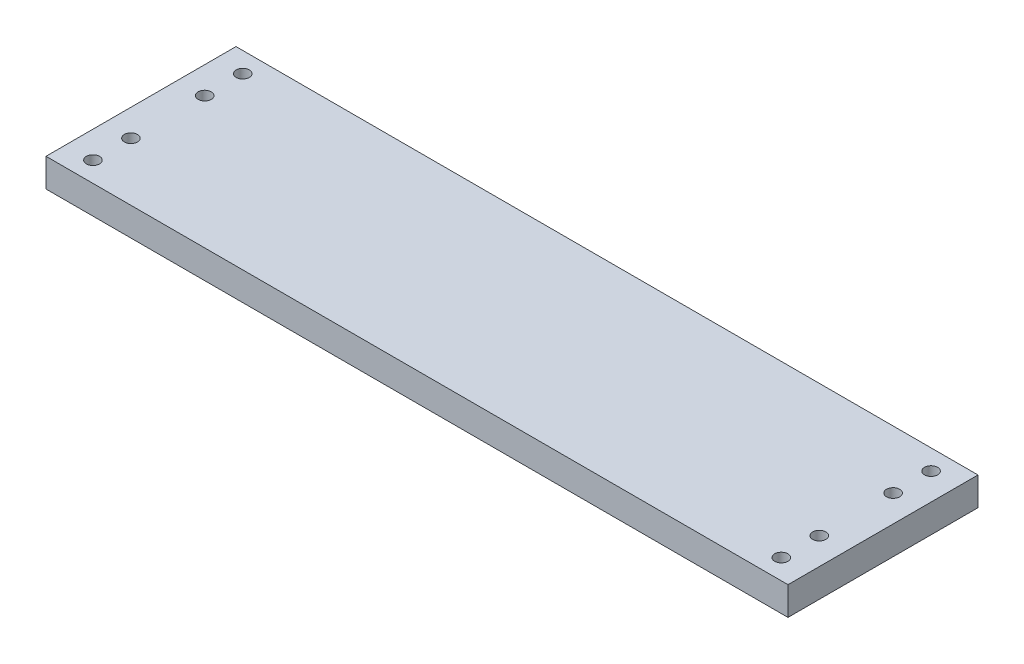
ISO-10303-21;
HEADER;
FILE_DESCRIPTION(('STEP AP214'),'2;1');
FILE_NAME('part.step','',(''),(''),'','','');
FILE_SCHEMA(('AUTOMOTIVE_DESIGN { 1 0 10303 214 1 1 1 1 }'));
ENDSEC;
DATA;
#1=APPLICATION_CONTEXT('core data for automotive mechanical design processes');
#2=APPLICATION_PROTOCOL_DEFINITION('international standard','automotive_design',2000,#1);
#3=PRODUCT_CONTEXT('',#1,'mechanical');
#4=PRODUCT('Part','Part','',(#3));
#5=PRODUCT_RELATED_PRODUCT_CATEGORY('part','',(#4));
#6=PRODUCT_DEFINITION_FORMATION('','',#4);
#7=PRODUCT_DEFINITION_CONTEXT('part definition',#1,'design');
#8=PRODUCT_DEFINITION('design','',#6,#7);
#9=PRODUCT_DEFINITION_SHAPE('','',#8);
#10=(LENGTH_UNIT() NAMED_UNIT(*) SI_UNIT(.MILLI.,.METRE.));
#11=(NAMED_UNIT(*) PLANE_ANGLE_UNIT() SI_UNIT($,.RADIAN.));
#12=(NAMED_UNIT(*) SI_UNIT($,.STERADIAN.) SOLID_ANGLE_UNIT());
#13=UNCERTAINTY_MEASURE_WITH_UNIT(LENGTH_MEASURE(1.E-05),#10,'distance_accuracy_value','');
#14=(GEOMETRIC_REPRESENTATION_CONTEXT(3) GLOBAL_UNCERTAINTY_ASSIGNED_CONTEXT((#13)) GLOBAL_UNIT_ASSIGNED_CONTEXT((#10,
#11,#12)) REPRESENTATION_CONTEXT('',''));
#15=CARTESIAN_POINT('',(0.,0.,0.));
#16=DIRECTION('',(0.,0.,1.));
#17=DIRECTION('',(1.,0.,0.));
#18=AXIS2_PLACEMENT_3D('',#15,#16,#17);
#19=CARTESIAN_POINT('',(-83.,6.35,-21.255));
#20=DIRECTION('',(0.,0.,-1.));
#21=DIRECTION('',(-1.,0.,0.));
#22=AXIS2_PLACEMENT_3D('',#19,#20,#21);
#23=PLANE('',#22);
#24=DIRECTION('',(1.,0.,0.));
#25=VECTOR('',#24,1.);
#26=CARTESIAN_POINT('',(-83.,0.,-21.255));
#27=LINE('',#26,#25);
#28=CARTESIAN_POINT('',(-83.,0.,-21.255));
#29=VERTEX_POINT('',#28);
#30=CARTESIAN_POINT('',(83.,0.,-21.255));
#31=VERTEX_POINT('',#30);
#32=EDGE_CURVE('E111',#29,#31,#27,.T.);
#33=ORIENTED_EDGE('',*,*,#32,.F.);
#34=DIRECTION('',(0.,-1.,0.));
#35=VECTOR('',#34,1.);
#36=CARTESIAN_POINT('',(-83.,6.35,-21.255));
#37=LINE('',#36,#35);
#38=CARTESIAN_POINT('',(-83.,6.35,-21.255));
#39=VERTEX_POINT('',#38);
#40=EDGE_CURVE('E13',#39,#29,#37,.T.);
#41=ORIENTED_EDGE('',*,*,#40,.F.);
#42=DIRECTION('',(1.,0.,0.));
#43=VECTOR('',#42,1.);
#44=CARTESIAN_POINT('',(-83.,6.35,-21.255));
#45=LINE('',#44,#43);
#46=CARTESIAN_POINT('',(83.,6.35,-21.255));
#47=VERTEX_POINT('',#46);
#48=EDGE_CURVE('E105',#39,#47,#45,.T.);
#49=ORIENTED_EDGE('',*,*,#48,.T.);
#50=DIRECTION('',(0.,-1.,0.));
#51=VECTOR('',#50,1.);
#52=CARTESIAN_POINT('',(83.,6.35,-21.255));
#53=LINE('',#52,#51);
#54=EDGE_CURVE('E48',#47,#31,#53,.T.);
#55=ORIENTED_EDGE('',*,*,#54,.T.);
#56=EDGE_LOOP('',(#33,#41,#49,#55));
#57=FACE_BOUND('',#56,.T.);
#58=ADVANCED_FACE('F45',(#57),#23,.T.);
#59=CARTESIAN_POINT('',(-83.,6.35,-21.255));
#60=DIRECTION('',(1.,0.,0.));
#61=DIRECTION('',(0.,0.,-1.));
#62=AXIS2_PLACEMENT_3D('',#59,#60,#61);
#63=PLANE('',#62);
#64=DIRECTION('',(0.,0.,1.));
#65=VECTOR('',#64,1.);
#66=CARTESIAN_POINT('',(-83.,0.,-21.255));
#67=LINE('',#66,#65);
#68=CARTESIAN_POINT('',(-83.,0.,21.255));
#69=VERTEX_POINT('',#68);
#70=EDGE_CURVE('E78',#29,#69,#67,.T.);
#71=ORIENTED_EDGE('',*,*,#70,.T.);
#72=DIRECTION('',(0.,-1.,0.));
#73=VECTOR('',#72,1.);
#74=CARTESIAN_POINT('',(-83.,6.35,21.255));
#75=LINE('',#74,#73);
#76=CARTESIAN_POINT('',(-83.,6.35,21.255));
#77=VERTEX_POINT('',#76);
#78=EDGE_CURVE('E54',#77,#69,#75,.T.);
#79=ORIENTED_EDGE('',*,*,#78,.F.);
#80=DIRECTION('',(0.,0.,1.));
#81=VECTOR('',#80,1.);
#82=CARTESIAN_POINT('',(-83.,6.35,-21.255));
#83=LINE('',#82,#81);
#84=EDGE_CURVE('E95',#39,#77,#83,.T.);
#85=ORIENTED_EDGE('',*,*,#84,.F.);
#86=ORIENTED_EDGE('',*,*,#40,.T.);
#87=EDGE_LOOP('',(#71,#79,#85,#86));
#88=FACE_BOUND('',#87,.T.);
#89=ADVANCED_FACE('F122',(#88),#63,.F.);
#90=CARTESIAN_POINT('',(-83.,6.35,21.255));
#91=DIRECTION('',(0.,0.,-1.));
#92=DIRECTION('',(-1.,0.,0.));
#93=AXIS2_PLACEMENT_3D('',#90,#91,#92);
#94=PLANE('',#93);
#95=DIRECTION('',(1.,0.,0.));
#96=VECTOR('',#95,1.);
#97=CARTESIAN_POINT('',(-83.,0.,21.255));
#98=LINE('',#97,#96);
#99=CARTESIAN_POINT('',(83.,0.,21.255));
#100=VERTEX_POINT('',#99);
#101=EDGE_CURVE('E102',#69,#100,#98,.T.);
#102=ORIENTED_EDGE('',*,*,#101,.T.);
#103=DIRECTION('',(0.,-1.,0.));
#104=VECTOR('',#103,1.);
#105=CARTESIAN_POINT('',(83.,6.35,21.255));
#106=LINE('',#105,#104);
#107=CARTESIAN_POINT('',(83.,6.35,21.255));
#108=VERTEX_POINT('',#107);
#109=EDGE_CURVE('E99',#108,#100,#106,.T.);
#110=ORIENTED_EDGE('',*,*,#109,.F.);
#111=DIRECTION('',(1.,0.,0.));
#112=VECTOR('',#111,1.);
#113=CARTESIAN_POINT('',(-83.,6.35,21.255));
#114=LINE('',#113,#112);
#115=EDGE_CURVE('E90',#77,#108,#114,.T.);
#116=ORIENTED_EDGE('',*,*,#115,.F.);
#117=ORIENTED_EDGE('',*,*,#78,.T.);
#118=EDGE_LOOP('',(#102,#110,#116,#117));
#119=FACE_BOUND('',#118,.T.);
#120=ADVANCED_FACE('F100',(#119),#94,.F.);
#121=CARTESIAN_POINT('',(83.,6.35,-21.255));
#122=DIRECTION('',(1.,0.,0.));
#123=DIRECTION('',(0.,0.,-1.));
#124=AXIS2_PLACEMENT_3D('',#121,#122,#123);
#125=PLANE('',#124);
#126=DIRECTION('',(0.,0.,1.));
#127=VECTOR('',#126,1.);
#128=CARTESIAN_POINT('',(83.,0.,-21.255));
#129=LINE('',#128,#127);
#130=EDGE_CURVE('E114',#31,#100,#129,.T.);
#131=ORIENTED_EDGE('',*,*,#130,.F.);
#132=ORIENTED_EDGE('',*,*,#54,.F.);
#133=DIRECTION('',(0.,0.,1.));
#134=VECTOR('',#133,1.);
#135=CARTESIAN_POINT('',(83.,6.35,-21.255));
#136=LINE('',#135,#134);
#137=EDGE_CURVE('E94',#47,#108,#136,.T.);
#138=ORIENTED_EDGE('',*,*,#137,.T.);
#139=ORIENTED_EDGE('',*,*,#109,.T.);
#140=EDGE_LOOP('',(#131,#132,#138,#139));
#141=FACE_BOUND('',#140,.T.);
#142=ADVANCED_FACE('F104',(#141),#125,.T.);
#143=CARTESIAN_POINT('',(0.,6.35,0.));
#144=DIRECTION('',(0.,-1.,0.));
#145=DIRECTION('',(0.,0.,-1.));
#146=AXIS2_PLACEMENT_3D('',#143,#144,#145);
#147=PLANE('',#146);
#148=CARTESIAN_POINT('',(-77.,6.35,8.25499999999999));
#149=DIRECTION('',(0.,-1.,0.));
#150=DIRECTION('',(0.,0.,-1.));
#151=AXIS2_PLACEMENT_3D('',#148,#149,#150);
#152=CIRCLE('',#151,1.47319999999999);
#153=CARTESIAN_POINT('',(-77.,6.35,6.7818));
#154=VERTEX_POINT('',#153);
#155=EDGE_CURVE('E218',#154,#154,#152,.T.);
#156=ORIENTED_EDGE('',*,*,#155,.T.);
#157=EDGE_LOOP('',(#156));
#158=FACE_BOUND('',#157,.T.);
#159=CARTESIAN_POINT('',(-77.,6.35,16.755));
#160=DIRECTION('',(0.,-1.,0.));
#161=DIRECTION('',(0.,0.,-1.));
#162=AXIS2_PLACEMENT_3D('',#159,#160,#161);
#163=CIRCLE('',#162,1.47319999999999);
#164=CARTESIAN_POINT('',(-77.,6.35,15.2818));
#165=VERTEX_POINT('',#164);
#166=EDGE_CURVE('E228',#165,#165,#163,.T.);
#167=ORIENTED_EDGE('',*,*,#166,.T.);
#168=EDGE_LOOP('',(#167));
#169=FACE_BOUND('',#168,.T.);
#170=CARTESIAN_POINT('',(77.,6.35,8.25500000000001));
#171=DIRECTION('',(0.,-1.,0.));
#172=DIRECTION('',(0.,0.,-1.));
#173=AXIS2_PLACEMENT_3D('',#170,#171,#172);
#174=CIRCLE('',#173,1.47319999999999);
#175=CARTESIAN_POINT('',(77.,6.35,6.78180000000001));
#176=VERTEX_POINT('',#175);
#177=EDGE_CURVE('E237',#176,#176,#174,.T.);
#178=ORIENTED_EDGE('',*,*,#177,.T.);
#179=EDGE_LOOP('',(#178));
#180=FACE_BOUND('',#179,.T.);
#181=CARTESIAN_POINT('',(77.,6.35,16.755));
#182=DIRECTION('',(0.,-1.,0.));
#183=DIRECTION('',(0.,0.,-1.));
#184=AXIS2_PLACEMENT_3D('',#181,#182,#183);
#185=CIRCLE('',#184,1.47319999999999);
#186=CARTESIAN_POINT('',(77.,6.35,15.2818));
#187=VERTEX_POINT('',#186);
#188=EDGE_CURVE('E246',#187,#187,#185,.T.);
#189=ORIENTED_EDGE('',*,*,#188,.T.);
#190=EDGE_LOOP('',(#189));
#191=FACE_BOUND('',#190,.T.);
#192=CARTESIAN_POINT('',(-77.,6.35,-8.25499999999999));
#193=DIRECTION('',(0.,1.,0.));
#194=DIRECTION('',(0.,0.,1.));
#195=AXIS2_PLACEMENT_3D('',#192,#193,#194);
#196=CIRCLE('',#195,1.47319999999999);
#197=CARTESIAN_POINT('',(-77.,6.35,-6.7818));
#198=VERTEX_POINT('',#197);
#199=EDGE_CURVE('E273',#198,#198,#196,.T.);
#200=ORIENTED_EDGE('',*,*,#199,.F.);
#201=EDGE_LOOP('',(#200));
#202=FACE_BOUND('',#201,.T.);
#203=CARTESIAN_POINT('',(-77.,6.35,-16.755));
#204=DIRECTION('',(0.,1.,0.));
#205=DIRECTION('',(0.,0.,1.));
#206=AXIS2_PLACEMENT_3D('',#203,#204,#205);
#207=CIRCLE('',#206,1.47319999999999);
#208=CARTESIAN_POINT('',(-77.,6.35,-15.2818));
#209=VERTEX_POINT('',#208);
#210=EDGE_CURVE('E276',#209,#209,#207,.T.);
#211=ORIENTED_EDGE('',*,*,#210,.F.);
#212=EDGE_LOOP('',(#211));
#213=FACE_BOUND('',#212,.T.);
#214=CARTESIAN_POINT('',(77.,6.35,-8.25500000000001));
#215=DIRECTION('',(0.,1.,0.));
#216=DIRECTION('',(0.,0.,1.));
#217=AXIS2_PLACEMENT_3D('',#214,#215,#216);
#218=CIRCLE('',#217,1.47319999999999);
#219=CARTESIAN_POINT('',(77.,6.35,-6.78180000000001));
#220=VERTEX_POINT('',#219);
#221=EDGE_CURVE('E279',#220,#220,#218,.T.);
#222=ORIENTED_EDGE('',*,*,#221,.F.);
#223=EDGE_LOOP('',(#222));
#224=FACE_BOUND('',#223,.T.);
#225=CARTESIAN_POINT('',(77.,6.35,-16.755));
#226=DIRECTION('',(0.,1.,0.));
#227=DIRECTION('',(0.,0.,1.));
#228=AXIS2_PLACEMENT_3D('',#225,#226,#227);
#229=CIRCLE('',#228,1.47319999999999);
#230=CARTESIAN_POINT('',(77.,6.35,-15.2818));
#231=VERTEX_POINT('',#230);
#232=EDGE_CURVE('E115',#231,#231,#229,.T.);
#233=ORIENTED_EDGE('',*,*,#232,.F.);
#234=EDGE_LOOP('',(#233));
#235=FACE_BOUND('',#234,.T.);
#236=ORIENTED_EDGE('',*,*,#48,.F.);
#237=ORIENTED_EDGE('',*,*,#84,.T.);
#238=ORIENTED_EDGE('',*,*,#115,.T.);
#239=ORIENTED_EDGE('',*,*,#137,.F.);
#240=EDGE_LOOP('',(#236,#237,#238,#239));
#241=FACE_BOUND('',#240,.T.);
#242=ADVANCED_FACE('F93',(#158,#169,#180,#191,#202,#213,#224,#235,#241),#147,.F.);
#243=CARTESIAN_POINT('',(0.,0.,0.));
#244=DIRECTION('',(0.,-1.,0.));
#245=DIRECTION('',(0.,0.,-1.));
#246=AXIS2_PLACEMENT_3D('',#243,#244,#245);
#247=PLANE('',#246);
#248=CARTESIAN_POINT('',(-77.,0.,8.25499999999999));
#249=DIRECTION('',(0.,-1.,0.));
#250=DIRECTION('',(0.,0.,-1.));
#251=AXIS2_PLACEMENT_3D('',#248,#249,#250);
#252=CIRCLE('',#251,3.90089389999999);
#253=CARTESIAN_POINT('',(-77.,0.,4.3541061));
#254=VERTEX_POINT('',#253);
#255=EDGE_CURVE('E216',#254,#254,#252,.T.);
#256=ORIENTED_EDGE('',*,*,#255,.F.);
#257=EDGE_LOOP('',(#256));
#258=FACE_BOUND('',#257,.T.);
#259=CARTESIAN_POINT('',(-77.,0.,16.755));
#260=DIRECTION('',(0.,-1.,0.));
#261=DIRECTION('',(0.,0.,-1.));
#262=AXIS2_PLACEMENT_3D('',#259,#260,#261);
#263=CIRCLE('',#262,3.90089389999999);
#264=CARTESIAN_POINT('',(-77.,0.,12.8541061));
#265=VERTEX_POINT('',#264);
#266=EDGE_CURVE('E222',#265,#265,#263,.T.);
#267=ORIENTED_EDGE('',*,*,#266,.F.);
#268=EDGE_LOOP('',(#267));
#269=FACE_BOUND('',#268,.T.);
#270=CARTESIAN_POINT('',(77.,0.,8.25500000000001));
#271=DIRECTION('',(0.,-1.,0.));
#272=DIRECTION('',(0.,0.,-1.));
#273=AXIS2_PLACEMENT_3D('',#270,#271,#272);
#274=CIRCLE('',#273,3.90089389999999);
#275=CARTESIAN_POINT('',(77.,0.,4.35410610000002));
#276=VERTEX_POINT('',#275);
#277=EDGE_CURVE('E231',#276,#276,#274,.T.);
#278=ORIENTED_EDGE('',*,*,#277,.F.);
#279=EDGE_LOOP('',(#278));
#280=FACE_BOUND('',#279,.T.);
#281=CARTESIAN_POINT('',(77.,0.,16.755));
#282=DIRECTION('',(0.,-1.,0.));
#283=DIRECTION('',(0.,0.,-1.));
#284=AXIS2_PLACEMENT_3D('',#281,#282,#283);
#285=CIRCLE('',#284,3.90089389999999);
#286=CARTESIAN_POINT('',(77.,0.,12.8541061));
#287=VERTEX_POINT('',#286);
#288=EDGE_CURVE('E240',#287,#287,#285,.T.);
#289=ORIENTED_EDGE('',*,*,#288,.F.);
#290=EDGE_LOOP('',(#289));
#291=FACE_BOUND('',#290,.T.);
#292=CARTESIAN_POINT('',(-77.,0.,-8.25499999999999));
#293=DIRECTION('',(0.,-1.,0.));
#294=DIRECTION('',(0.,0.,-1.));
#295=AXIS2_PLACEMENT_3D('',#292,#293,#294);
#296=CIRCLE('',#295,3.90089389999999);
#297=CARTESIAN_POINT('',(-77.,0.,-12.1558939));
#298=VERTEX_POINT('',#297);
#299=EDGE_CURVE('E249',#298,#298,#296,.T.);
#300=ORIENTED_EDGE('',*,*,#299,.F.);
#301=EDGE_LOOP('',(#300));
#302=FACE_BOUND('',#301,.T.);
#303=CARTESIAN_POINT('',(-77.,0.,-16.755));
#304=DIRECTION('',(0.,-1.,0.));
#305=DIRECTION('',(0.,0.,-1.));
#306=AXIS2_PLACEMENT_3D('',#303,#304,#305);
#307=CIRCLE('',#306,3.90089389999999);
#308=CARTESIAN_POINT('',(-77.,0.,-20.6558939));
#309=VERTEX_POINT('',#308);
#310=EDGE_CURVE('E255',#309,#309,#307,.T.);
#311=ORIENTED_EDGE('',*,*,#310,.F.);
#312=EDGE_LOOP('',(#311));
#313=FACE_BOUND('',#312,.T.);
#314=CARTESIAN_POINT('',(77.,0.,-8.25500000000001));
#315=DIRECTION('',(0.,-1.,0.));
#316=DIRECTION('',(0.,0.,-1.));
#317=AXIS2_PLACEMENT_3D('',#314,#315,#316);
#318=CIRCLE('',#317,3.90089389999999);
#319=CARTESIAN_POINT('',(77.,0.,-12.1558939));
#320=VERTEX_POINT('',#319);
#321=EDGE_CURVE('E261',#320,#320,#318,.T.);
#322=ORIENTED_EDGE('',*,*,#321,.F.);
#323=EDGE_LOOP('',(#322));
#324=FACE_BOUND('',#323,.T.);
#325=CARTESIAN_POINT('',(77.,0.,-16.755));
#326=DIRECTION('',(0.,-1.,0.));
#327=DIRECTION('',(0.,0.,-1.));
#328=AXIS2_PLACEMENT_3D('',#325,#326,#327);
#329=CIRCLE('',#328,3.90089389999999);
#330=CARTESIAN_POINT('',(77.,0.,-20.6558939));
#331=VERTEX_POINT('',#330);
#332=EDGE_CURVE('E267',#331,#331,#329,.T.);
#333=ORIENTED_EDGE('',*,*,#332,.F.);
#334=EDGE_LOOP('',(#333));
#335=FACE_BOUND('',#334,.T.);
#336=ORIENTED_EDGE('',*,*,#32,.T.);
#337=ORIENTED_EDGE('',*,*,#130,.T.);
#338=ORIENTED_EDGE('',*,*,#101,.F.);
#339=ORIENTED_EDGE('',*,*,#70,.F.);
#340=EDGE_LOOP('',(#336,#337,#338,#339));
#341=FACE_BOUND('',#340,.T.);
#342=ADVANCED_FACE('F120',(#258,#269,#280,#291,#302,#313,#324,#335,#341),#247,.T.);
#343=CARTESIAN_POINT('',(77.,6.35,-16.755));
#344=DIRECTION('',(0.,1.,0.));
#345=DIRECTION('',(0.,0.,1.));
#346=AXIS2_PLACEMENT_3D('',#343,#344,#345);
#347=CYLINDRICAL_SURFACE('',#346,1.47319999999999);
#348=CARTESIAN_POINT('',(77.,2.79274236496316,-16.755));
#349=DIRECTION('',(0.,-1.,0.));
#350=DIRECTION('',(0.,0.,-1.));
#351=AXIS2_PLACEMENT_3D('',#348,#349,#350);
#352=CIRCLE('',#351,1.47319999999999);
#353=CARTESIAN_POINT('',(77.,2.79274236496316,-18.2282));
#354=VERTEX_POINT('',#353);
#355=EDGE_CURVE('E270',#354,#354,#352,.T.);
#356=ORIENTED_EDGE('',*,*,#355,.T.);
#357=EDGE_LOOP('',(#356));
#358=FACE_BOUND('',#357,.T.);
#359=ORIENTED_EDGE('',*,*,#232,.T.);
#360=EDGE_LOOP('',(#359));
#361=FACE_BOUND('',#360,.T.);
#362=ADVANCED_FACE('F141',(#358,#361),#347,.F.);
#363=CARTESIAN_POINT('',(77.,6.35,-8.25500000000001));
#364=DIRECTION('',(0.,1.,0.));
#365=DIRECTION('',(0.,0.,1.));
#366=AXIS2_PLACEMENT_3D('',#363,#364,#365);
#367=CYLINDRICAL_SURFACE('',#366,1.47319999999999);
#368=CARTESIAN_POINT('',(77.,2.79274236496316,-8.25500000000001));
#369=DIRECTION('',(0.,-1.,0.));
#370=DIRECTION('',(0.,0.,-1.));
#371=AXIS2_PLACEMENT_3D('',#368,#369,#370);
#372=CIRCLE('',#371,1.47319999999999);
#373=CARTESIAN_POINT('',(77.,2.79274236496316,-9.7282));
#374=VERTEX_POINT('',#373);
#375=EDGE_CURVE('E264',#374,#374,#372,.T.);
#376=ORIENTED_EDGE('',*,*,#375,.T.);
#377=EDGE_LOOP('',(#376));
#378=FACE_BOUND('',#377,.T.);
#379=ORIENTED_EDGE('',*,*,#221,.T.);
#380=EDGE_LOOP('',(#379));
#381=FACE_BOUND('',#380,.T.);
#382=ADVANCED_FACE('F148',(#378,#381),#367,.F.);
#383=CARTESIAN_POINT('',(-77.,6.35,-16.755));
#384=DIRECTION('',(0.,1.,0.));
#385=DIRECTION('',(0.,0.,1.));
#386=AXIS2_PLACEMENT_3D('',#383,#384,#385);
#387=CYLINDRICAL_SURFACE('',#386,1.47319999999999);
#388=CARTESIAN_POINT('',(-77.,2.79274236496316,-16.755));
#389=DIRECTION('',(0.,-1.,0.));
#390=DIRECTION('',(0.,0.,-1.));
#391=AXIS2_PLACEMENT_3D('',#388,#389,#390);
#392=CIRCLE('',#391,1.47319999999999);
#393=CARTESIAN_POINT('',(-77.,2.79274236496316,-18.2282));
#394=VERTEX_POINT('',#393);
#395=EDGE_CURVE('E258',#394,#394,#392,.T.);
#396=ORIENTED_EDGE('',*,*,#395,.T.);
#397=EDGE_LOOP('',(#396));
#398=FACE_BOUND('',#397,.T.);
#399=ORIENTED_EDGE('',*,*,#210,.T.);
#400=EDGE_LOOP('',(#399));
#401=FACE_BOUND('',#400,.T.);
#402=ADVANCED_FACE('F152',(#398,#401),#387,.F.);
#403=CARTESIAN_POINT('',(-77.,6.35,-8.25499999999999));
#404=DIRECTION('',(0.,1.,0.));
#405=DIRECTION('',(0.,0.,1.));
#406=AXIS2_PLACEMENT_3D('',#403,#404,#405);
#407=CYLINDRICAL_SURFACE('',#406,1.47319999999999);
#408=CARTESIAN_POINT('',(-77.,2.79274236496316,-8.25499999999999));
#409=DIRECTION('',(0.,-1.,0.));
#410=DIRECTION('',(0.,0.,-1.));
#411=AXIS2_PLACEMENT_3D('',#408,#409,#410);
#412=CIRCLE('',#411,1.47319999999999);
#413=CARTESIAN_POINT('',(-77.,2.79274236496316,-9.72819999999999));
#414=VERTEX_POINT('',#413);
#415=EDGE_CURVE('E252',#414,#414,#412,.T.);
#416=ORIENTED_EDGE('',*,*,#415,.T.);
#417=EDGE_LOOP('',(#416));
#418=FACE_BOUND('',#417,.T.);
#419=ORIENTED_EDGE('',*,*,#199,.T.);
#420=EDGE_LOOP('',(#419));
#421=FACE_BOUND('',#420,.T.);
#422=ADVANCED_FACE('F156',(#418,#421),#407,.F.);
#423=CARTESIAN_POINT('',(77.,0.,-16.755));
#424=DIRECTION('',(0.,-1.,0.));
#425=DIRECTION('',(0.,0.,-1.));
#426=AXIS2_PLACEMENT_3D('',#423,#424,#425);
#427=CONICAL_SURFACE('',#426,3.90089389999999,0.715584993317675);
#428=ORIENTED_EDGE('',*,*,#355,.F.);
#429=EDGE_LOOP('',(#428));
#430=FACE_BOUND('',#429,.T.);
#431=ORIENTED_EDGE('',*,*,#332,.T.);
#432=EDGE_LOOP('',(#431));
#433=FACE_BOUND('',#432,.T.);
#434=ADVANCED_FACE('F160',(#430,#433),#427,.F.);
#435=CARTESIAN_POINT('',(77.,0.,-8.25500000000001));
#436=DIRECTION('',(0.,-1.,0.));
#437=DIRECTION('',(0.,0.,-1.));
#438=AXIS2_PLACEMENT_3D('',#435,#436,#437);
#439=CONICAL_SURFACE('',#438,3.90089389999999,0.715584993317675);
#440=ORIENTED_EDGE('',*,*,#375,.F.);
#441=EDGE_LOOP('',(#440));
#442=FACE_BOUND('',#441,.T.);
#443=ORIENTED_EDGE('',*,*,#321,.T.);
#444=EDGE_LOOP('',(#443));
#445=FACE_BOUND('',#444,.T.);
#446=ADVANCED_FACE('F164',(#442,#445),#439,.F.);
#447=CARTESIAN_POINT('',(-77.,0.,-16.755));
#448=DIRECTION('',(0.,-1.,0.));
#449=DIRECTION('',(0.,0.,-1.));
#450=AXIS2_PLACEMENT_3D('',#447,#448,#449);
#451=CONICAL_SURFACE('',#450,3.90089389999999,0.715584993317675);
#452=ORIENTED_EDGE('',*,*,#395,.F.);
#453=EDGE_LOOP('',(#452));
#454=FACE_BOUND('',#453,.T.);
#455=ORIENTED_EDGE('',*,*,#310,.T.);
#456=EDGE_LOOP('',(#455));
#457=FACE_BOUND('',#456,.T.);
#458=ADVANCED_FACE('F168',(#454,#457),#451,.F.);
#459=CARTESIAN_POINT('',(-77.,0.,-8.25499999999999));
#460=DIRECTION('',(0.,-1.,0.));
#461=DIRECTION('',(0.,0.,-1.));
#462=AXIS2_PLACEMENT_3D('',#459,#460,#461);
#463=CONICAL_SURFACE('',#462,3.90089389999999,0.715584993317675);
#464=ORIENTED_EDGE('',*,*,#415,.F.);
#465=EDGE_LOOP('',(#464));
#466=FACE_BOUND('',#465,.T.);
#467=ORIENTED_EDGE('',*,*,#299,.T.);
#468=EDGE_LOOP('',(#467));
#469=FACE_BOUND('',#468,.T.);
#470=ADVANCED_FACE('F172',(#466,#469),#463,.F.);
#471=CARTESIAN_POINT('',(77.,0.,16.755));
#472=DIRECTION('',(0.,-1.,0.));
#473=DIRECTION('',(0.,0.,-1.));
#474=AXIS2_PLACEMENT_3D('',#471,#472,#473);
#475=CYLINDRICAL_SURFACE('',#474,1.47319999999999);
#476=ORIENTED_EDGE('',*,*,#188,.F.);
#477=EDGE_LOOP('',(#476));
#478=FACE_BOUND('',#477,.T.);
#479=CARTESIAN_POINT('',(77.,2.79274236496316,16.755));
#480=DIRECTION('',(0.,-1.,0.));
#481=DIRECTION('',(0.,0.,-1.));
#482=AXIS2_PLACEMENT_3D('',#479,#480,#481);
#483=CIRCLE('',#482,1.47319999999999);
#484=CARTESIAN_POINT('',(77.,2.79274236496316,15.2818));
#485=VERTEX_POINT('',#484);
#486=EDGE_CURVE('E243',#485,#485,#483,.T.);
#487=ORIENTED_EDGE('',*,*,#486,.T.);
#488=EDGE_LOOP('',(#487));
#489=FACE_BOUND('',#488,.T.);
#490=ADVANCED_FACE('F176',(#478,#489),#475,.F.);
#491=CARTESIAN_POINT('',(77.,0.,16.755));
#492=DIRECTION('',(0.,-1.,0.));
#493=DIRECTION('',(0.,0.,-1.));
#494=AXIS2_PLACEMENT_3D('',#491,#492,#493);
#495=CONICAL_SURFACE('',#494,3.90089389999999,0.715584993317675);
#496=ORIENTED_EDGE('',*,*,#486,.F.);
#497=EDGE_LOOP('',(#496));
#498=FACE_BOUND('',#497,.T.);
#499=ORIENTED_EDGE('',*,*,#288,.T.);
#500=EDGE_LOOP('',(#499));
#501=FACE_BOUND('',#500,.T.);
#502=ADVANCED_FACE('F180',(#498,#501),#495,.F.);
#503=CARTESIAN_POINT('',(77.,0.,8.25500000000001));
#504=DIRECTION('',(0.,-1.,0.));
#505=DIRECTION('',(0.,0.,-1.));
#506=AXIS2_PLACEMENT_3D('',#503,#504,#505);
#507=CYLINDRICAL_SURFACE('',#506,1.47319999999999);
#508=ORIENTED_EDGE('',*,*,#177,.F.);
#509=EDGE_LOOP('',(#508));
#510=FACE_BOUND('',#509,.T.);
#511=CARTESIAN_POINT('',(77.,2.79274236496316,8.25500000000001));
#512=DIRECTION('',(0.,-1.,0.));
#513=DIRECTION('',(0.,0.,-1.));
#514=AXIS2_PLACEMENT_3D('',#511,#512,#513);
#515=CIRCLE('',#514,1.47319999999999);
#516=CARTESIAN_POINT('',(77.,2.79274236496316,6.78180000000001));
#517=VERTEX_POINT('',#516);
#518=EDGE_CURVE('E234',#517,#517,#515,.T.);
#519=ORIENTED_EDGE('',*,*,#518,.T.);
#520=EDGE_LOOP('',(#519));
#521=FACE_BOUND('',#520,.T.);
#522=ADVANCED_FACE('F184',(#510,#521),#507,.F.);
#523=CARTESIAN_POINT('',(77.,0.,8.25500000000001));
#524=DIRECTION('',(0.,-1.,0.));
#525=DIRECTION('',(0.,0.,-1.));
#526=AXIS2_PLACEMENT_3D('',#523,#524,#525);
#527=CONICAL_SURFACE('',#526,3.90089389999999,0.715584993317675);
#528=ORIENTED_EDGE('',*,*,#518,.F.);
#529=EDGE_LOOP('',(#528));
#530=FACE_BOUND('',#529,.T.);
#531=ORIENTED_EDGE('',*,*,#277,.T.);
#532=EDGE_LOOP('',(#531));
#533=FACE_BOUND('',#532,.T.);
#534=ADVANCED_FACE('F188',(#530,#533),#527,.F.);
#535=CARTESIAN_POINT('',(-77.,0.,16.755));
#536=DIRECTION('',(0.,-1.,0.));
#537=DIRECTION('',(0.,0.,-1.));
#538=AXIS2_PLACEMENT_3D('',#535,#536,#537);
#539=CYLINDRICAL_SURFACE('',#538,1.47319999999999);
#540=ORIENTED_EDGE('',*,*,#166,.F.);
#541=EDGE_LOOP('',(#540));
#542=FACE_BOUND('',#541,.T.);
#543=CARTESIAN_POINT('',(-77.,2.79274236496316,16.755));
#544=DIRECTION('',(0.,-1.,0.));
#545=DIRECTION('',(0.,0.,-1.));
#546=AXIS2_PLACEMENT_3D('',#543,#544,#545);
#547=CIRCLE('',#546,1.47319999999999);
#548=CARTESIAN_POINT('',(-77.,2.79274236496316,15.2818));
#549=VERTEX_POINT('',#548);
#550=EDGE_CURVE('E225',#549,#549,#547,.T.);
#551=ORIENTED_EDGE('',*,*,#550,.T.);
#552=EDGE_LOOP('',(#551));
#553=FACE_BOUND('',#552,.T.);
#554=ADVANCED_FACE('F192',(#542,#553),#539,.F.);
#555=CARTESIAN_POINT('',(-77.,0.,16.755));
#556=DIRECTION('',(0.,-1.,0.));
#557=DIRECTION('',(0.,0.,-1.));
#558=AXIS2_PLACEMENT_3D('',#555,#556,#557);
#559=CONICAL_SURFACE('',#558,3.90089389999999,0.715584993317675);
#560=ORIENTED_EDGE('',*,*,#550,.F.);
#561=EDGE_LOOP('',(#560));
#562=FACE_BOUND('',#561,.T.);
#563=ORIENTED_EDGE('',*,*,#266,.T.);
#564=EDGE_LOOP('',(#563));
#565=FACE_BOUND('',#564,.T.);
#566=ADVANCED_FACE('F196',(#562,#565),#559,.F.);
#567=CARTESIAN_POINT('',(-77.,0.,8.25499999999999));
#568=DIRECTION('',(0.,-1.,0.));
#569=DIRECTION('',(0.,0.,-1.));
#570=AXIS2_PLACEMENT_3D('',#567,#568,#569);
#571=CYLINDRICAL_SURFACE('',#570,1.47319999999999);
#572=ORIENTED_EDGE('',*,*,#155,.F.);
#573=EDGE_LOOP('',(#572));
#574=FACE_BOUND('',#573,.T.);
#575=CARTESIAN_POINT('',(-77.,2.79274236496316,8.25499999999999));
#576=DIRECTION('',(0.,-1.,0.));
#577=DIRECTION('',(0.,0.,-1.));
#578=AXIS2_PLACEMENT_3D('',#575,#576,#577);
#579=CIRCLE('',#578,1.47319999999999);
#580=CARTESIAN_POINT('',(-77.,2.79274236496316,6.7818));
#581=VERTEX_POINT('',#580);
#582=EDGE_CURVE('E213',#581,#581,#579,.T.);
#583=ORIENTED_EDGE('',*,*,#582,.T.);
#584=EDGE_LOOP('',(#583));
#585=FACE_BOUND('',#584,.T.);
#586=ADVANCED_FACE('F200',(#574,#585),#571,.F.);
#587=CARTESIAN_POINT('',(-77.,0.,8.25499999999999));
#588=DIRECTION('',(0.,-1.,0.));
#589=DIRECTION('',(0.,0.,-1.));
#590=AXIS2_PLACEMENT_3D('',#587,#588,#589);
#591=CONICAL_SURFACE('',#590,3.90089389999999,0.715584993317675);
#592=ORIENTED_EDGE('',*,*,#582,.F.);
#593=EDGE_LOOP('',(#592));
#594=FACE_BOUND('',#593,.T.);
#595=ORIENTED_EDGE('',*,*,#255,.T.);
#596=EDGE_LOOP('',(#595));
#597=FACE_BOUND('',#596,.T.);
#598=ADVANCED_FACE('F204',(#594,#597),#591,.F.);
#599=CLOSED_SHELL('',(#58,#89,#120,#142,#242,#342,#362,#382,#402,#422,#434,#446,#458,#470,#490,
#502,#522,#534,#554,#566,#586,#598));
#600=MANIFOLD_SOLID_BREP('B2',#599);
#601=ADVANCED_BREP_SHAPE_REPRESENTATION('',(#18,#600),#14);
#602=SHAPE_DEFINITION_REPRESENTATION(#9,#601);
ENDSEC;
END-ISO-10303-21;
